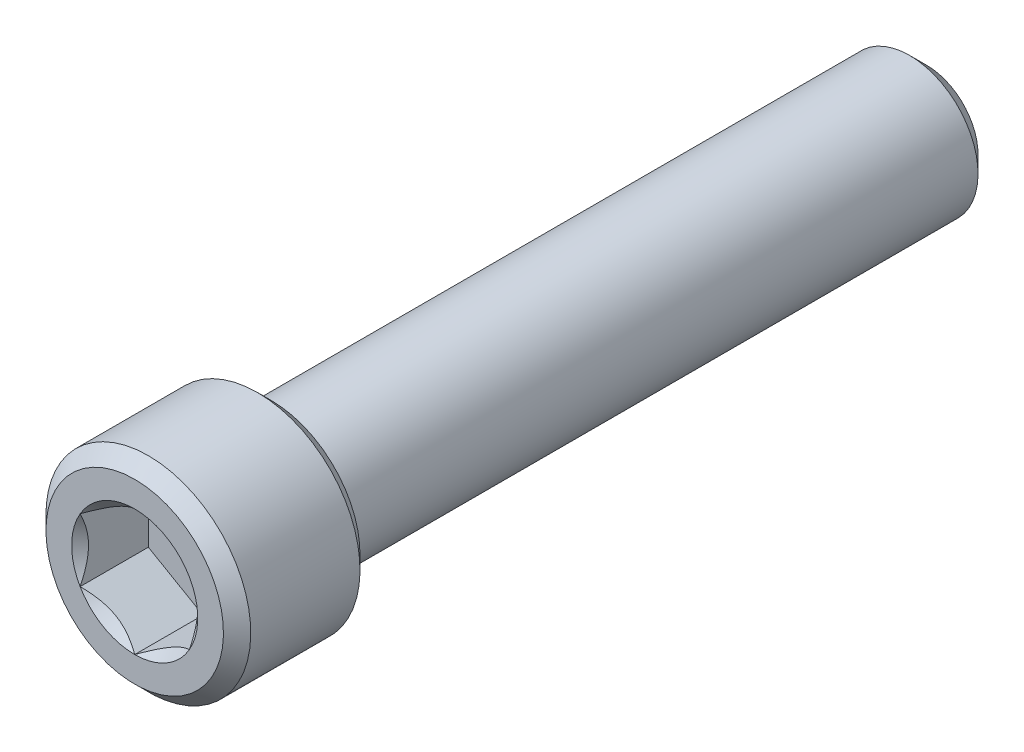
ISO-10303-21;
HEADER;
FILE_DESCRIPTION(('STEP AP214'),'2;1');
FILE_NAME('part.step','',(''),(''),'','','');
FILE_SCHEMA(('AUTOMOTIVE_DESIGN { 1 0 10303 214 1 1 1 1 }'));
ENDSEC;
DATA;
#1=APPLICATION_CONTEXT('core data for automotive mechanical design processes');
#2=APPLICATION_PROTOCOL_DEFINITION('international standard','automotive_design',2000,#1);
#3=PRODUCT_CONTEXT('',#1,'mechanical');
#4=PRODUCT('Part','Part','',(#3));
#5=PRODUCT_RELATED_PRODUCT_CATEGORY('part','',(#4));
#6=PRODUCT_DEFINITION_FORMATION('','',#4);
#7=PRODUCT_DEFINITION_CONTEXT('part definition',#1,'design');
#8=PRODUCT_DEFINITION('design','',#6,#7);
#9=PRODUCT_DEFINITION_SHAPE('','',#8);
#10=(LENGTH_UNIT() NAMED_UNIT(*) SI_UNIT(.MILLI.,.METRE.));
#11=(NAMED_UNIT(*) PLANE_ANGLE_UNIT() SI_UNIT($,.RADIAN.));
#12=(NAMED_UNIT(*) SI_UNIT($,.STERADIAN.) SOLID_ANGLE_UNIT());
#13=UNCERTAINTY_MEASURE_WITH_UNIT(LENGTH_MEASURE(1.E-05),#10,'distance_accuracy_value','');
#14=(GEOMETRIC_REPRESENTATION_CONTEXT(3) GLOBAL_UNCERTAINTY_ASSIGNED_CONTEXT((#13)) GLOBAL_UNIT_ASSIGNED_CONTEXT((#10,
#11,#12)) REPRESENTATION_CONTEXT('',''));
#15=CARTESIAN_POINT('',(0.,0.,0.));
#16=DIRECTION('',(0.,0.,1.));
#17=DIRECTION('',(1.,0.,0.));
#18=AXIS2_PLACEMENT_3D('',#15,#16,#17);
#19=CARTESIAN_POINT('',(0.,2.98732222221433,-23.01875));
#20=DIRECTION('',(0.,0.,-1.));
#21=DIRECTION('',(0.,1.,0.));
#22=AXIS2_PLACEMENT_3D('',#19,#20,#21);
#23=PLANE('',#22);
#24=CARTESIAN_POINT('',(0.,0.,-23.01875));
#25=DIRECTION('',(0.,0.,-1.));
#26=DIRECTION('',(0.,1.,0.));
#27=AXIS2_PLACEMENT_3D('',#24,#25,#26);
#28=CIRCLE('',#27,2.98732222221433);
#29=CARTESIAN_POINT('',(0.,2.98732222221433,-23.01875));
#30=VERTEX_POINT('',#29);
#31=EDGE_CURVE('E209',#30,#30,#28,.T.);
#32=ORIENTED_EDGE('',*,*,#31,.T.);
#33=EDGE_LOOP('',(#32));
#34=FACE_BOUND('',#33,.T.);
#35=ADVANCED_FACE('F39',(#34),#23,.T.);
#36=CARTESIAN_POINT('',(0.,0.,23.01875));
#37=DIRECTION('',(0.,0.,1.));
#38=DIRECTION('',(0.,-1.,0.));
#39=AXIS2_PLACEMENT_3D('',#36,#37,#38);
#40=PLANE('',#39);
#41=CARTESIAN_POINT('',(0.,0.,23.01875));
#42=DIRECTION('',(0.,0.,1.));
#43=DIRECTION('',(1.,0.,0.));
#44=AXIS2_PLACEMENT_3D('',#41,#42,#43);
#45=CIRCLE('',#44,3.66617420935413);
#46=CARTESIAN_POINT('',(0.,-3.66617420935413,23.01875));
#47=VERTEX_POINT('',#46);
#48=CARTESIAN_POINT('',(3.17500000000001,-1.83308710467706,23.01875));
#49=VERTEX_POINT('',#48);
#50=EDGE_CURVE('E108',#47,#49,#45,.T.);
#51=ORIENTED_EDGE('',*,*,#50,.F.);
#52=CARTESIAN_POINT('',(-3.175,-1.83308710467706,23.01875));
#53=VERTEX_POINT('',#52);
#54=EDGE_CURVE('E96',#53,#47,#45,.T.);
#55=ORIENTED_EDGE('',*,*,#54,.F.);
#56=CARTESIAN_POINT('',(-3.17500000000001,1.83308710467706,23.01875));
#57=VERTEX_POINT('',#56);
#58=EDGE_CURVE('E110',#57,#53,#45,.T.);
#59=ORIENTED_EDGE('',*,*,#58,.F.);
#60=CARTESIAN_POINT('',(0.,3.66617420935413,23.01875));
#61=VERTEX_POINT('',#60);
#62=EDGE_CURVE('E59',#61,#57,#45,.T.);
#63=ORIENTED_EDGE('',*,*,#62,.F.);
#64=CARTESIAN_POINT('',(3.175,1.83308710467707,23.01875));
#65=VERTEX_POINT('',#64);
#66=EDGE_CURVE('E62',#65,#61,#45,.T.);
#67=ORIENTED_EDGE('',*,*,#66,.F.);
#68=EDGE_CURVE('E139',#49,#65,#45,.T.);
#69=ORIENTED_EDGE('',*,*,#68,.F.);
#70=EDGE_LOOP('',(#51,#55,#59,#63,#67,#69));
#71=FACE_BOUND('',#70,.T.);
#72=CARTESIAN_POINT('',(0.,0.,23.01875));
#73=DIRECTION('',(0.,0.,-1.));
#74=DIRECTION('',(0.,1.,0.));
#75=AXIS2_PLACEMENT_3D('',#72,#73,#74);
#76=CIRCLE('',#75,5.159375);
#77=CARTESIAN_POINT('',(0.,5.159375,23.01875));
#78=VERTEX_POINT('',#77);
#79=EDGE_CURVE('E55',#78,#78,#76,.T.);
#80=ORIENTED_EDGE('',*,*,#79,.F.);
#81=EDGE_LOOP('',(#80));
#82=FACE_BOUND('',#81,.T.);
#83=ADVANCED_FACE('F134',(#71,#82),#40,.T.);
#84=CARTESIAN_POINT('',(0.,0.,22.225));
#85=DIRECTION('',(0.,0.,-1.));
#86=DIRECTION('',(0.,1.,0.));
#87=AXIS2_PLACEMENT_3D('',#84,#85,#86);
#88=CONICAL_SURFACE('',#87,5.953125,0.785398163397449);
#89=ORIENTED_EDGE('',*,*,#79,.T.);
#90=EDGE_LOOP('',(#89));
#91=FACE_BOUND('',#90,.T.);
#92=CARTESIAN_POINT('',(0.,0.,22.225));
#93=DIRECTION('',(0.,0.,-1.));
#94=DIRECTION('',(0.,1.,0.));
#95=AXIS2_PLACEMENT_3D('',#92,#93,#94);
#96=CIRCLE('',#95,5.953125);
#97=CARTESIAN_POINT('',(0.,5.95312499999999,22.225));
#98=VERTEX_POINT('',#97);
#99=EDGE_CURVE('E226',#98,#98,#96,.T.);
#100=ORIENTED_EDGE('',*,*,#99,.F.);
#101=EDGE_LOOP('',(#100));
#102=FACE_BOUND('',#101,.T.);
#103=ADVANCED_FACE('F207',(#91,#102),#88,.T.);
#104=CARTESIAN_POINT('',(0.,0.,-23.01875));
#105=DIRECTION('',(0.,0.,-1.));
#106=DIRECTION('',(0.,1.,0.));
#107=AXIS2_PLACEMENT_3D('',#104,#105,#106);
#108=CYLINDRICAL_SURFACE('',#107,5.953125);
#109=ORIENTED_EDGE('',*,*,#99,.T.);
#110=EDGE_LOOP('',(#109));
#111=FACE_BOUND('',#110,.T.);
#112=CARTESIAN_POINT('',(0.,0.,15.875));
#113=DIRECTION('',(0.,0.,-1.));
#114=DIRECTION('',(0.,1.,0.));
#115=AXIS2_PLACEMENT_3D('',#112,#113,#114);
#116=CIRCLE('',#115,5.953125);
#117=CARTESIAN_POINT('',(0.,5.95312499999999,15.875));
#118=VERTEX_POINT('',#117);
#119=EDGE_CURVE('E222',#118,#118,#116,.T.);
#120=ORIENTED_EDGE('',*,*,#119,.F.);
#121=EDGE_LOOP('',(#120));
#122=FACE_BOUND('',#121,.T.);
#123=ADVANCED_FACE('F234',(#111,#122),#108,.T.);
#124=CARTESIAN_POINT('',(0.,0.,15.08125));
#125=DIRECTION('',(0.,0.,1.));
#126=DIRECTION('',(0.,-1.,0.));
#127=AXIS2_PLACEMENT_3D('',#124,#125,#126);
#128=CONICAL_SURFACE('',#127,5.159375,0.785398163397453);
#129=ORIENTED_EDGE('',*,*,#119,.T.);
#130=EDGE_LOOP('',(#129));
#131=FACE_BOUND('',#130,.T.);
#132=CARTESIAN_POINT('',(0.,0.,15.08125));
#133=DIRECTION('',(0.,0.,-1.));
#134=DIRECTION('',(0.,1.,0.));
#135=AXIS2_PLACEMENT_3D('',#132,#133,#134);
#136=CIRCLE('',#135,5.159375);
#137=CARTESIAN_POINT('',(0.,5.15937499999999,15.08125));
#138=VERTEX_POINT('',#137);
#139=EDGE_CURVE('E221',#138,#138,#136,.T.);
#140=ORIENTED_EDGE('',*,*,#139,.F.);
#141=EDGE_LOOP('',(#140));
#142=FACE_BOUND('',#141,.T.);
#143=ADVANCED_FACE('F239',(#131,#142),#128,.T.);
#144=CARTESIAN_POINT('',(0.,5.15937499999999,15.08125));
#145=DIRECTION('',(0.,0.,-1.));
#146=DIRECTION('',(0.,1.,0.));
#147=AXIS2_PLACEMENT_3D('',#144,#145,#146);
#148=PLANE('',#147);
#149=ORIENTED_EDGE('',*,*,#139,.T.);
#150=EDGE_LOOP('',(#149));
#151=FACE_BOUND('',#150,.T.);
#152=CARTESIAN_POINT('',(0.,0.,15.08125));
#153=DIRECTION('',(0.,0.,-1.));
#154=DIRECTION('',(0.,1.,0.));
#155=AXIS2_PLACEMENT_3D('',#152,#153,#154);
#156=CIRCLE('',#155,3.9751);
#157=CARTESIAN_POINT('',(0.,3.9751,15.08125));
#158=VERTEX_POINT('',#157);
#159=EDGE_CURVE('E214',#158,#158,#156,.T.);
#160=ORIENTED_EDGE('',*,*,#159,.F.);
#161=EDGE_LOOP('',(#160));
#162=FACE_BOUND('',#161,.T.);
#163=ADVANCED_FACE('F246',(#151,#162),#148,.T.);
#164=CARTESIAN_POINT('',(0.,0.,-23.01875));
#165=DIRECTION('',(0.,0.,-1.));
#166=DIRECTION('',(0.,1.,0.));
#167=AXIS2_PLACEMENT_3D('',#164,#165,#166);
#168=CYLINDRICAL_SURFACE('',#167,3.97510000000001);
#169=ORIENTED_EDGE('',*,*,#159,.T.);
#170=EDGE_LOOP('',(#169));
#171=FACE_BOUND('',#170,.T.);
#172=CARTESIAN_POINT('',(0.,0.,-22.0309722222143));
#173=DIRECTION('',(0.,0.,-1.));
#174=DIRECTION('',(0.,1.,0.));
#175=AXIS2_PLACEMENT_3D('',#172,#173,#174);
#176=CIRCLE('',#175,3.97510000000001);
#177=CARTESIAN_POINT('',(0.,3.97510000000001,-22.0309722222143));
#178=VERTEX_POINT('',#177);
#179=EDGE_CURVE('E213',#178,#178,#176,.T.);
#180=ORIENTED_EDGE('',*,*,#179,.F.);
#181=EDGE_LOOP('',(#180));
#182=FACE_BOUND('',#181,.T.);
#183=ADVANCED_FACE('F255',(#171,#182),#168,.T.);
#184=CARTESIAN_POINT('',(0.,0.,-23.01875));
#185=DIRECTION('',(0.,0.,1.));
#186=DIRECTION('',(0.,-1.,0.));
#187=AXIS2_PLACEMENT_3D('',#184,#185,#186);
#188=CONICAL_SURFACE('',#187,2.98732222221433,0.785398163397451);
#189=ORIENTED_EDGE('',*,*,#179,.T.);
#190=EDGE_LOOP('',(#189));
#191=FACE_BOUND('',#190,.T.);
#192=ORIENTED_EDGE('',*,*,#31,.F.);
#193=EDGE_LOOP('',(#192));
#194=FACE_BOUND('',#193,.T.);
#195=ADVANCED_FACE('F256',(#191,#194),#188,.T.);
#196=CARTESIAN_POINT('',(0.,0.,23.01875));
#197=DIRECTION('',(0.,0.,1.));
#198=DIRECTION('',(1.,0.,0.));
#199=AXIS2_PLACEMENT_3D('',#196,#197,#198);
#200=CONICAL_SURFACE('',#199,3.66617420935413,0.78539816339745);
#201=ORIENTED_EDGE('',*,*,#50,.T.);
#202=CARTESIAN_POINT('',(-0.000199999999999354,-3.66628967940796,23.0188654755089));
#203=CARTESIAN_POINT('',(0.108938349949827,-3.60327862368552,22.9559089836918));
#204=CARTESIAN_POINT('',(0.219901628077946,-3.53921394518809,22.8966501042347));
#205=CARTESIAN_POINT('',(0.446167846345947,-3.40857908316254,22.7881486557306));
#206=CARTESIAN_POINT('',(0.561492303252262,-3.34199647692353,22.7389664539387));
#207=CARTESIAN_POINT('',(0.794038522480625,-3.207735854653,22.654716458874));
#208=CARTESIAN_POINT('',(0.911201066281149,-3.14009202845083,22.6194369144994));
#209=CARTESIAN_POINT('',(1.14810544464628,-3.00331522182952,22.5650815701348));
#210=CARTESIAN_POINT('',(1.26784004264355,-2.93418641944448,22.5459651975296));
#211=CARTESIAN_POINT('',(1.47419791875158,-2.81504564412412,22.5287171306232));
#212=CARTESIAN_POINT('',(1.56055470772915,-2.76518752876156,22.5261639336138));
#213=CARTESIAN_POINT('',(1.73312781652471,-2.66555239794355,22.5304662731233));
#214=CARTESIAN_POINT('',(1.8193440764928,-2.61577541704245,22.5373251080214));
#215=CARTESIAN_POINT('',(1.99095979158713,-2.51669303773558,22.5600598833037));
#216=CARTESIAN_POINT('',(2.07635822425327,-2.46738822964741,22.5759459096873));
#217=CARTESIAN_POINT('',(2.24568840330547,-2.36962540518969,22.615867983998));
#218=CARTESIAN_POINT('',(2.32962026161974,-2.32116732419836,22.6399034070852));
#219=CARTESIAN_POINT('',(2.47862357928411,-2.23514021863469,22.6893552344172));
#220=CARTESIAN_POINT('',(2.54402485119173,-2.19738077669348,22.713471719301));
#221=CARTESIAN_POINT('',(2.6736532502051,-2.12253978562849,22.7655914671372));
#222=CARTESIAN_POINT('',(2.73788034144172,-2.08545825721376,22.7935948486035));
#223=CARTESIAN_POINT('',(2.8649580345126,-2.01208991691129,22.8528605655445));
#224=CARTESIAN_POINT('',(2.92781225074872,-1.97580101824767,22.8841126533542));
#225=CARTESIAN_POINT('',(3.05235662084809,-1.90389529264474,22.9494653443919));
#226=CARTESIAN_POINT('',(3.11404746097871,-1.8682780694888,22.9835641995185));
#227=CARTESIAN_POINT('',(3.1752,-1.83297163462323,23.0188654755089));
#228=B_SPLINE_CURVE_WITH_KNOTS('',3,(#202,#203,#204,#205,#206,#207,#208,#209,#210,#211,#212,
#213,#214,#215,#216,#217,#218,#219,#220,#221,#222,#223,#224,#225,#226,#227),.UNSPECIFIED.,.F.,
.F.,(4,2,2,2,2,2,2,2,2,2,2,2,4),(0.,0.422910572436808,0.848285055427806,1.26690402276127,
1.68446903107506,1.98329272958351,2.2822211754689,2.58148426995465,2.88072442418451,
3.11844134429546,3.35616551414405,3.59316134346766,3.83001269744429),.UNSPECIFIED.);
#229=EDGE_CURVE('E11',#47,#49,#228,.T.);
#230=ORIENTED_EDGE('',*,*,#229,.F.);
#231=EDGE_LOOP('',(#201,#230));
#232=FACE_BOUND('',#231,.T.);
#233=ADVANCED_FACE('F115',(#232),#200,.F.);
#234=ORIENTED_EDGE('',*,*,#68,.T.);
#235=CARTESIAN_POINT('',(3.175,-3.65592387452516,24.1947245261065));
#236=CARTESIAN_POINT('',(3.175,-3.56690614739902,24.127529557288));
#237=CARTESIAN_POINT('',(3.175,-3.47739001482927,24.0609841167795));
#238=CARTESIAN_POINT('',(3.175,-3.29716433407819,23.929483107989));
#239=CARTESIAN_POINT('',(3.175,-3.20645449195236,23.8645279430093));
#240=CARTESIAN_POINT('',(3.175,-3.02298124672425,23.7360364725883));
#241=CARTESIAN_POINT('',(3.175,-2.93020737789476,23.6725150605195));
#242=CARTESIAN_POINT('',(3.175,-2.74308490461526,23.5478432312395));
#243=CARTESIAN_POINT('',(3.175,-2.64873641209623,23.486692646518));
#244=CARTESIAN_POINT('',(3.175,-2.45276910629101,23.3638772914686));
#245=CARTESIAN_POINT('',(3.175,-2.35104296923552,23.3023829000351));
#246=CARTESIAN_POINT('',(3.175,-2.14521620329061,23.1834400241102));
#247=CARTESIAN_POINT('',(3.175,-2.04111520164361,23.1259921806284));
#248=CARTESIAN_POINT('',(3.175,-1.8305483898592,23.0163819262114));
#249=CARTESIAN_POINT('',(3.175,-1.72409073387149,22.9642039734131));
#250=CARTESIAN_POINT('',(3.175,-1.50827203793058,22.8663015698251));
#251=CARTESIAN_POINT('',(3.175,-1.39891233941784,22.8205741969929));
#252=CARTESIAN_POINT('',(3.175,-1.18604701054559,22.7405561753707));
#253=CARTESIAN_POINT('',(3.175,-1.08277848917347,22.7056413049656));
#254=CARTESIAN_POINT('',(3.175,-0.873755153890325,22.6440963349262));
#255=CARTESIAN_POINT('',(3.175,-0.768000169236099,22.6174668060366));
#256=CARTESIAN_POINT('',(3.175,-0.556394353071966,22.5743261950481));
#257=CARTESIAN_POINT('',(3.175,-0.450579451492894,22.5576417495798));
#258=CARTESIAN_POINT('',(3.175,-0.237818454981047,22.534715141782));
#259=CARTESIAN_POINT('',(3.175,-0.13087255768011,22.5284711844441));
#260=CARTESIAN_POINT('',(3.175,0.0792250150830025,22.5268892728023));
#261=CARTESIAN_POINT('',(3.175,0.182373911993818,22.531164748002));
#262=CARTESIAN_POINT('',(3.175,0.387788153537297,22.5495326749881));
#263=CARTESIAN_POINT('',(3.175,0.490053411359904,22.5636260804471));
#264=CARTESIAN_POINT('',(3.175,0.694689208906973,22.6011006951935));
#265=CARTESIAN_POINT('',(3.175,0.797030337701613,22.6246399593543));
#266=CARTESIAN_POINT('',(3.175,0.999482692253837,22.6797509009592));
#267=CARTESIAN_POINT('',(3.175,1.09959410383402,22.7113219063006));
#268=CARTESIAN_POINT('',(3.175,1.30666025401972,22.7844470266187));
#269=CARTESIAN_POINT('',(3.175,1.4133805811312,22.8266582387017));
#270=CARTESIAN_POINT('',(3.175,1.6240351260801,22.9175553663247));
#271=CARTESIAN_POINT('',(3.175,1.72796839622315,22.9662434515018));
#272=CARTESIAN_POINT('',(3.175,1.93357808805447,23.0689437756761));
#273=CARTESIAN_POINT('',(3.175,2.03524592560239,23.1229730621693));
#274=CARTESIAN_POINT('',(3.175,2.23624195707291,23.2351589013647));
#275=CARTESIAN_POINT('',(3.175,2.3355705197654,23.2933147976569));
#276=CARTESIAN_POINT('',(3.175,2.52730642275902,23.4099651155039));
#277=CARTESIAN_POINT('',(3.175,2.61981218330511,23.4682986191933));
#278=CARTESIAN_POINT('',(3.175,2.80323560367684,23.5874186494698));
#279=CARTESIAN_POINT('',(3.175,2.89415314246283,23.6482053618594));
#280=CARTESIAN_POINT('',(3.175,3.07387072487128,23.7712912164829));
#281=CARTESIAN_POINT('',(3.175,3.16268196996071,23.8335740620494));
#282=CARTESIAN_POINT('',(3.175,3.33909075370388,23.9597868324862));
#283=CARTESIAN_POINT('',(3.175,3.42668861940901,24.0237162997018));
#284=CARTESIAN_POINT('',(3.175,3.51377838474595,24.0883189780567));
#285=B_SPLINE_CURVE_WITH_KNOTS('',3,(#235,#236,#237,#238,#239,#240,#241,#242,#243,#244,#245,
#246,#247,#248,#249,#250,#251,#252,#253,#254,#255,#256,#257,#258,#259,#260,#261,#262,#263,#264,
#265,#266,#267,#268,#269,#270,#271,#272,#273,#274,#275,#276,#277,#278,#279,#280,#281,#282,#283,
#284),.UNSPECIFIED.,.F.,.F.,(4,2,2,2,2,2,2,2,2,2,2,2,2,2,2,2,2,2,2,2,2,2,2,2,4),(0.,
0.334601712013317,0.669287419770513,1.00656636796479,1.3438214421939,1.70035269072414,
2.05694029057745,2.41244349871029,2.76778514705124,3.09453137075716,3.42130009774479,
3.74219200698696,4.06302874036784,4.37225254917033,4.68150639886781,4.99616636831742,
5.31080001541914,5.65482708645254,5.99896969199844,6.34424851858142,6.68947254507109,
7.01751396994993,7.34558028700741,7.67098168170701,7.99629359145139),.UNSPECIFIED.);
#286=EDGE_CURVE('E140',#49,#65,#285,.T.);
#287=ORIENTED_EDGE('',*,*,#286,.F.);
#288=EDGE_LOOP('',(#234,#287));
#289=FACE_BOUND('',#288,.T.);
#290=ADVANCED_FACE('F270',(#289),#200,.F.);
#291=ORIENTED_EDGE('',*,*,#66,.T.);
#292=CARTESIAN_POINT('',(3.1752,1.83297163462322,23.0188654755089));
#293=CARTESIAN_POINT('',(3.06606165005017,1.89598269034567,22.9559089836918));
#294=CARTESIAN_POINT('',(2.95509837192205,1.9600473688431,22.8966501042347));
#295=CARTESIAN_POINT('',(2.72883215365405,2.09068223086865,22.7881486557306));
#296=CARTESIAN_POINT('',(2.61350769674774,2.15726483710766,22.7389664539387));
#297=CARTESIAN_POINT('',(2.38096147751937,2.29152545937818,22.654716458874));
#298=CARTESIAN_POINT('',(2.26379893371885,2.35916928558036,22.6194369144995));
#299=CARTESIAN_POINT('',(2.02689455535372,2.49594609220167,22.5650815701348));
#300=CARTESIAN_POINT('',(1.90715995735645,2.5650748945867,22.5459651975296));
#301=CARTESIAN_POINT('',(1.70080208124842,2.68421566990707,22.5287171306232));
#302=CARTESIAN_POINT('',(1.61444529227085,2.73407378526962,22.5261639336138));
#303=CARTESIAN_POINT('',(1.44187218347529,2.83370891608763,22.5304662731233));
#304=CARTESIAN_POINT('',(1.3556559235072,2.88348589698873,22.5373251080214));
#305=CARTESIAN_POINT('',(1.18404020841287,2.98256827629561,22.5600598833037));
#306=CARTESIAN_POINT('',(1.09864177574673,3.03187308438378,22.5759459096873));
#307=CARTESIAN_POINT('',(0.929311596694528,3.1296359088415,22.615867983998));
#308=CARTESIAN_POINT('',(0.845379738380254,3.17809398983283,22.6399034070852));
#309=CARTESIAN_POINT('',(0.696376420715886,3.2641210953965,22.6893552344172));
#310=CARTESIAN_POINT('',(0.630975148808269,3.3018805373377,22.713471719301));
#311=CARTESIAN_POINT('',(0.501346749794894,3.3767215284027,22.7655914671372));
#312=CARTESIAN_POINT('',(0.437119658558277,3.41380305681742,22.7935948486035));
#313=CARTESIAN_POINT('',(0.3100419654874,3.48717139711989,22.8528605655445));
#314=CARTESIAN_POINT('',(0.247187749251276,3.52346029578352,22.8841126533542));
#315=CARTESIAN_POINT('',(0.122643379151906,3.59536602138644,22.9494653443919));
#316=CARTESIAN_POINT('',(0.0609525390212892,3.63098324454239,22.9835641995185));
#317=CARTESIAN_POINT('',(-0.000200000000001283,3.66628967940796,23.0188654755089));
#318=B_SPLINE_CURVE_WITH_KNOTS('',3,(#292,#293,#294,#295,#296,#297,#298,#299,#300,#301,#302,
#303,#304,#305,#306,#307,#308,#309,#310,#311,#312,#313,#314,#315,#316,#317),.UNSPECIFIED.,.F.,
.F.,(4,2,2,2,2,2,2,2,2,2,2,2,4),(0.,0.422910572436807,0.848285055427807,1.26690402276127,
1.68446903107506,1.98329272958351,2.2822211754689,2.58148426995465,2.88072442418451,
3.11844134429546,3.35616551414405,3.59316134346766,3.8300126974443),.UNSPECIFIED.);
#319=EDGE_CURVE('E148',#65,#61,#318,.T.);
#320=ORIENTED_EDGE('',*,*,#319,.F.);
#321=EDGE_LOOP('',(#291,#320));
#322=FACE_BOUND('',#321,.T.);
#323=ADVANCED_FACE('F307',(#322),#200,.F.);
#324=ORIENTED_EDGE('',*,*,#62,.T.);
#325=CARTESIAN_POINT('',(0.00019999999999895,3.66628967940796,23.0188654755089));
#326=CARTESIAN_POINT('',(-0.108938349949827,3.60327862368552,22.9559089836918));
#327=CARTESIAN_POINT('',(-0.219901628077946,3.53921394518808,22.8966501042347));
#328=CARTESIAN_POINT('',(-0.446167846345948,3.40857908316253,22.7881486557306));
#329=CARTESIAN_POINT('',(-0.561492303252264,3.34199647692353,22.7389664539387));
#330=CARTESIAN_POINT('',(-0.794038522480627,3.207735854653,22.654716458874));
#331=CARTESIAN_POINT('',(-0.911201066281151,3.14009202845083,22.6194369144995));
#332=CARTESIAN_POINT('',(-1.14810544464628,3.00331522182952,22.5650815701348));
#333=CARTESIAN_POINT('',(-1.26784004264355,2.93418641944448,22.5459651975296));
#334=CARTESIAN_POINT('',(-1.47419791875158,2.81504564412411,22.5287171306232));
#335=CARTESIAN_POINT('',(-1.56055470772915,2.76518752876156,22.5261639336138));
#336=CARTESIAN_POINT('',(-1.73312781652471,2.66555239794355,22.5304662731233));
#337=CARTESIAN_POINT('',(-1.8193440764928,2.61577541704245,22.5373251080214));
#338=CARTESIAN_POINT('',(-1.99095979158713,2.51669303773557,22.5600598833037));
#339=CARTESIAN_POINT('',(-2.07635822425327,2.4673882296474,22.5759459096873));
#340=CARTESIAN_POINT('',(-2.24568840330547,2.36962540518969,22.615867983998));
#341=CARTESIAN_POINT('',(-2.32962026161975,2.32116732419836,22.6399034070852));
#342=CARTESIAN_POINT('',(-2.47862357928411,2.23514021863468,22.6893552344172));
#343=CARTESIAN_POINT('',(-2.54402485119173,2.19738077669348,22.713471719301));
#344=CARTESIAN_POINT('',(-2.67365325020511,2.12253978562849,22.7655914671372));
#345=CARTESIAN_POINT('',(-2.73788034144172,2.08545825721376,22.7935948486035));
#346=CARTESIAN_POINT('',(-2.8649580345126,2.01208991691129,22.8528605655445));
#347=CARTESIAN_POINT('',(-2.92781225074872,1.97580101824766,22.8841126533542));
#348=CARTESIAN_POINT('',(-3.05235662084809,1.90389529264474,22.9494653443919));
#349=CARTESIAN_POINT('',(-3.11404746097871,1.86827806948879,22.9835641995185));
#350=CARTESIAN_POINT('',(-3.1752,1.83297163462322,23.0188654755089));
#351=B_SPLINE_CURVE_WITH_KNOTS('',3,(#325,#326,#327,#328,#329,#330,#331,#332,#333,#334,#335,
#336,#337,#338,#339,#340,#341,#342,#343,#344,#345,#346,#347,#348,#349,#350),.UNSPECIFIED.,.F.,
.F.,(4,2,2,2,2,2,2,2,2,2,2,2,4),(0.,0.422910572436808,0.848285055427808,1.26690402276127,
1.68446903107506,1.98329272958351,2.2822211754689,2.58148426995465,2.88072442418451,
3.11844134429546,3.35616551414405,3.59316134346766,3.8300126974443),.UNSPECIFIED.);
#352=EDGE_CURVE('E168',#61,#57,#351,.T.);
#353=ORIENTED_EDGE('',*,*,#352,.F.);
#354=EDGE_LOOP('',(#324,#353));
#355=FACE_BOUND('',#354,.T.);
#356=ADVANCED_FACE('F304',(#355),#200,.F.);
#357=ORIENTED_EDGE('',*,*,#58,.T.);
#358=CARTESIAN_POINT('',(-3.175,-3.65592387452516,24.1947245261065));
#359=CARTESIAN_POINT('',(-3.175,-3.56690614739902,24.127529557288));
#360=CARTESIAN_POINT('',(-3.175,-3.47739001482928,24.0609841167795));
#361=CARTESIAN_POINT('',(-3.175,-3.29716433407819,23.929483107989));
#362=CARTESIAN_POINT('',(-3.175,-3.20645449195236,23.8645279430093));
#363=CARTESIAN_POINT('',(-3.175,-3.02298124672425,23.7360364725883));
#364=CARTESIAN_POINT('',(-3.175,-2.93020737789477,23.6725150605195));
#365=CARTESIAN_POINT('',(-3.175,-2.74308490461527,23.5478432312395));
#366=CARTESIAN_POINT('',(-3.175,-2.64873641209624,23.486692646518));
#367=CARTESIAN_POINT('',(-3.175,-2.45276910629102,23.3638772914686));
#368=CARTESIAN_POINT('',(-3.175,-2.35104296923552,23.3023829000351));
#369=CARTESIAN_POINT('',(-3.175,-2.14521620329061,23.1834400241102));
#370=CARTESIAN_POINT('',(-3.175,-2.04111520164361,23.1259921806284));
#371=CARTESIAN_POINT('',(-3.175,-1.8305483898592,23.0163819262114));
#372=CARTESIAN_POINT('',(-3.175,-1.72409073387149,22.9642039734131));
#373=CARTESIAN_POINT('',(-3.175,-1.50827203793059,22.8663015698251));
#374=CARTESIAN_POINT('',(-3.175,-1.39891233941785,22.8205741969929));
#375=CARTESIAN_POINT('',(-3.175,-1.1860470105456,22.7405561753708));
#376=CARTESIAN_POINT('',(-3.175,-1.08277848917348,22.7056413049656));
#377=CARTESIAN_POINT('',(-3.175,-0.873755153890329,22.6440963349262));
#378=CARTESIAN_POINT('',(-3.175,-0.768000169236102,22.6174668060366));
#379=CARTESIAN_POINT('',(-3.175,-0.556394353071968,22.5743261950481));
#380=CARTESIAN_POINT('',(-3.175,-0.450579451492896,22.5576417495798));
#381=CARTESIAN_POINT('',(-3.175,-0.237818454981048,22.534715141782));
#382=CARTESIAN_POINT('',(-3.175,-0.130872557680111,22.5284711844441));
#383=CARTESIAN_POINT('',(-3.175,0.0792250150830016,22.5268892728023));
#384=CARTESIAN_POINT('',(-3.175,0.182373911993817,22.531164748002));
#385=CARTESIAN_POINT('',(-3.175,0.387788153537296,22.5495326749881));
#386=CARTESIAN_POINT('',(-3.175,0.490053411359903,22.5636260804471));
#387=CARTESIAN_POINT('',(-3.175,0.694689208906972,22.6011006951935));
#388=CARTESIAN_POINT('',(-3.175,0.797030337701613,22.6246399593543));
#389=CARTESIAN_POINT('',(-3.175,0.999482692253837,22.6797509009592));
#390=CARTESIAN_POINT('',(-3.175,1.09959410383402,22.7113219063006));
#391=CARTESIAN_POINT('',(-3.175,1.30666025401972,22.7844470266187));
#392=CARTESIAN_POINT('',(-3.175,1.4133805811312,22.8266582387017));
#393=CARTESIAN_POINT('',(-3.175,1.6240351260801,22.9175553663247));
#394=CARTESIAN_POINT('',(-3.175,1.72796839622315,22.9662434515018));
#395=CARTESIAN_POINT('',(-3.175,1.93357808805447,23.0689437756761));
#396=CARTESIAN_POINT('',(-3.175,2.03524592560239,23.1229730621693));
#397=CARTESIAN_POINT('',(-3.175,2.23624195707291,23.2351589013648));
#398=CARTESIAN_POINT('',(-3.175,2.3355705197654,23.2933147976569));
#399=CARTESIAN_POINT('',(-3.175,2.52730642275902,23.4099651155039));
#400=CARTESIAN_POINT('',(-3.175,2.61981218330511,23.4682986191933));
#401=CARTESIAN_POINT('',(-3.175,2.80323560367684,23.5874186494698));
#402=CARTESIAN_POINT('',(-3.175,2.89415314246283,23.6482053618594));
#403=CARTESIAN_POINT('',(-3.175,3.07387072487128,23.7712912164829));
#404=CARTESIAN_POINT('',(-3.175,3.16268196996071,23.8335740620494));
#405=CARTESIAN_POINT('',(-3.175,3.33909075370388,23.9597868324862));
#406=CARTESIAN_POINT('',(-3.175,3.42668861940901,24.0237162997018));
#407=CARTESIAN_POINT('',(-3.175,3.51377838474595,24.0883189780567));
#408=B_SPLINE_CURVE_WITH_KNOTS('',3,(#358,#359,#360,#361,#362,#363,#364,#365,#366,#367,#368,
#369,#370,#371,#372,#373,#374,#375,#376,#377,#378,#379,#380,#381,#382,#383,#384,#385,#386,#387,
#388,#389,#390,#391,#392,#393,#394,#395,#396,#397,#398,#399,#400,#401,#402,#403,#404,#405,#406,
#407),.UNSPECIFIED.,.F.,.F.,(4,2,2,2,2,2,2,2,2,2,2,2,2,2,2,2,2,2,2,2,2,2,2,2,4),(0.,
0.334601712013316,0.669287419770512,1.00656636796479,1.3438214421939,1.70035269072413,
2.05694029057745,2.41244349871029,2.76778514705124,3.09453137075716,3.42130009774479,
3.74219200698696,4.06302874036785,4.37225254917033,4.68150639886781,4.99616636831742,
5.31080001541914,5.65482708645254,5.99896969199844,6.34424851858142,6.68947254507109,
7.01751396994994,7.34558028700741,7.67098168170701,7.99629359145139),.UNSPECIFIED.);
#409=EDGE_CURVE('E121',#57,#53,#408,.F.);
#410=ORIENTED_EDGE('',*,*,#409,.F.);
#411=EDGE_LOOP('',(#357,#410));
#412=FACE_BOUND('',#411,.T.);
#413=ADVANCED_FACE('F158',(#412),#200,.F.);
#414=ORIENTED_EDGE('',*,*,#54,.T.);
#415=CARTESIAN_POINT('',(-3.1752,-1.83297163462323,23.0188654755089));
#416=CARTESIAN_POINT('',(-3.06606165005017,-1.89598269034567,22.9559089836918));
#417=CARTESIAN_POINT('',(-2.95509837192205,-1.9600473688431,22.8966501042347));
#418=CARTESIAN_POINT('',(-2.72883215365405,-2.09068223086865,22.7881486557306));
#419=CARTESIAN_POINT('',(-2.61350769674774,-2.15726483710766,22.7389664539387));
#420=CARTESIAN_POINT('',(-2.38096147751937,-2.29152545937819,22.654716458874));
#421=CARTESIAN_POINT('',(-2.26379893371885,-2.35916928558036,22.6194369144994));
#422=CARTESIAN_POINT('',(-2.02689455535372,-2.49594609220167,22.5650815701348));
#423=CARTESIAN_POINT('',(-1.90715995735645,-2.56507489458671,22.5459651975296));
#424=CARTESIAN_POINT('',(-1.70080208124842,-2.68421566990707,22.5287171306232));
#425=CARTESIAN_POINT('',(-1.61444529227084,-2.73407378526963,22.5261639336138));
#426=CARTESIAN_POINT('',(-1.44187218347528,-2.83370891608764,22.5304662731233));
#427=CARTESIAN_POINT('',(-1.35565592350719,-2.88348589698873,22.5373251080214));
#428=CARTESIAN_POINT('',(-1.18404020841287,-2.98256827629561,22.5600598833037));
#429=CARTESIAN_POINT('',(-1.09864177574673,-3.03187308438378,22.5759459096873));
#430=CARTESIAN_POINT('',(-0.929311596694525,-3.1296359088415,22.615867983998));
#431=CARTESIAN_POINT('',(-0.845379738380251,-3.17809398983283,22.6399034070852));
#432=CARTESIAN_POINT('',(-0.696376420715883,-3.2641210953965,22.6893552344172));
#433=CARTESIAN_POINT('',(-0.630975148808267,-3.30188053733771,22.713471719301));
#434=CARTESIAN_POINT('',(-0.501346749794892,-3.3767215284027,22.7655914671372));
#435=CARTESIAN_POINT('',(-0.437119658558275,-3.41380305681743,22.7935948486035));
#436=CARTESIAN_POINT('',(-0.310041965487398,-3.48717139711989,22.8528605655445));
#437=CARTESIAN_POINT('',(-0.247187749251274,-3.52346029578352,22.8841126533542));
#438=CARTESIAN_POINT('',(-0.122643379151905,-3.59536602138645,22.9494653443919));
#439=CARTESIAN_POINT('',(-0.0609525390212888,-3.63098324454239,22.9835641995185));
#440=CARTESIAN_POINT('',(0.000200000000001496,-3.66628967940796,23.0188654755089));
#441=B_SPLINE_CURVE_WITH_KNOTS('',3,(#415,#416,#417,#418,#419,#420,#421,#422,#423,#424,#425,
#426,#427,#428,#429,#430,#431,#432,#433,#434,#435,#436,#437,#438,#439,#440),.UNSPECIFIED.,.F.,
.F.,(4,2,2,2,2,2,2,2,2,2,2,2,4),(0.,0.422910572436811,0.84828505542781,1.26690402276127,
1.68446903107506,1.98329272958352,2.2822211754689,2.58148426995466,2.88072442418452,
3.11844134429546,3.35616551414405,3.59316134346767,3.8300126974443),.UNSPECIFIED.);
#442=EDGE_CURVE('E105',#53,#47,#441,.T.);
#443=ORIENTED_EDGE('',*,*,#442,.F.);
#444=EDGE_LOOP('',(#414,#443));
#445=FACE_BOUND('',#444,.T.);
#446=ADVANCED_FACE('F99',(#445),#200,.F.);
#447=CARTESIAN_POINT('',(0.,0.,19.05));
#448=DIRECTION('',(0.,0.,1.));
#449=DIRECTION('',(1.,0.,0.));
#450=AXIS2_PLACEMENT_3D('',#447,#448,#449);
#451=PLANE('',#450);
#452=DIRECTION('',(0.866025403784439,-0.5,0.));
#453=VECTOR('',#452,1.);
#454=CARTESIAN_POINT('',(-3.175,-1.83308710467706,19.05));
#455=LINE('',#454,#453);
#456=CARTESIAN_POINT('',(-3.175,-1.83308710467706,19.05));
#457=VERTEX_POINT('',#456);
#458=CARTESIAN_POINT('',(0.,-3.66617420935412,19.05));
#459=VERTEX_POINT('',#458);
#460=EDGE_CURVE('E124',#457,#459,#455,.T.);
#461=ORIENTED_EDGE('',*,*,#460,.T.);
#462=DIRECTION('',(0.866025403784439,0.5,0.));
#463=VECTOR('',#462,1.);
#464=CARTESIAN_POINT('',(0.,-3.66617420935412,19.05));
#465=LINE('',#464,#463);
#466=CARTESIAN_POINT('',(3.175,-1.83308710467706,19.05));
#467=VERTEX_POINT('',#466);
#468=EDGE_CURVE('E126',#459,#467,#465,.T.);
#469=ORIENTED_EDGE('',*,*,#468,.T.);
#470=DIRECTION('',(0.,1.,0.));
#471=VECTOR('',#470,1.);
#472=CARTESIAN_POINT('',(3.175,-1.83308710467706,19.05));
#473=LINE('',#472,#471);
#474=CARTESIAN_POINT('',(3.175,1.83308710467706,19.05));
#475=VERTEX_POINT('',#474);
#476=EDGE_CURVE('E285',#467,#475,#473,.T.);
#477=ORIENTED_EDGE('',*,*,#476,.T.);
#478=DIRECTION('',(-0.866025403784439,0.5,0.));
#479=VECTOR('',#478,1.);
#480=CARTESIAN_POINT('',(3.175,1.83308710467706,19.05));
#481=LINE('',#480,#479);
#482=CARTESIAN_POINT('',(0.,3.66617420935412,19.05));
#483=VERTEX_POINT('',#482);
#484=EDGE_CURVE('E289',#475,#483,#481,.T.);
#485=ORIENTED_EDGE('',*,*,#484,.T.);
#486=DIRECTION('',(-0.866025403784438,-0.5,0.));
#487=VECTOR('',#486,1.);
#488=CARTESIAN_POINT('',(0.,3.66617420935412,19.05));
#489=LINE('',#488,#487);
#490=CARTESIAN_POINT('',(-3.175,1.83308710467706,19.05));
#491=VERTEX_POINT('',#490);
#492=EDGE_CURVE('E288',#483,#491,#489,.T.);
#493=ORIENTED_EDGE('',*,*,#492,.T.);
#494=DIRECTION('',(0.,-1.,0.));
#495=VECTOR('',#494,1.);
#496=CARTESIAN_POINT('',(-3.175,1.83308710467706,19.05));
#497=LINE('',#496,#495);
#498=EDGE_CURVE('E133',#491,#457,#497,.T.);
#499=ORIENTED_EDGE('',*,*,#498,.T.);
#500=EDGE_LOOP('',(#461,#469,#477,#485,#493,#499));
#501=FACE_BOUND('',#500,.T.);
#502=ADVANCED_FACE('F160',(#501),#451,.T.);
#503=CARTESIAN_POINT('',(0.,-3.66617420935412,19.05));
#504=DIRECTION('',(0.5,-0.866025403784439,0.));
#505=DIRECTION('',(0.866025403784439,0.5,0.));
#506=AXIS2_PLACEMENT_3D('',#503,#504,#505);
#507=PLANE('',#506);
#508=DIRECTION('',(0.,0.,1.));
#509=VECTOR('',#508,1.);
#510=CARTESIAN_POINT('',(0.,-3.66617420935412,19.05));
#511=LINE('',#510,#509);
#512=EDGE_CURVE('E118',#459,#47,#511,.T.);
#513=ORIENTED_EDGE('',*,*,#512,.T.);
#514=ORIENTED_EDGE('',*,*,#229,.T.);
#515=DIRECTION('',(0.,0.,1.));
#516=VECTOR('',#515,1.);
#517=CARTESIAN_POINT('',(3.175,-1.83308710467706,19.05));
#518=LINE('',#517,#516);
#519=EDGE_CURVE('E127',#467,#49,#518,.T.);
#520=ORIENTED_EDGE('',*,*,#519,.F.);
#521=ORIENTED_EDGE('',*,*,#468,.F.);
#522=EDGE_LOOP('',(#513,#514,#520,#521));
#523=FACE_BOUND('',#522,.T.);
#524=ADVANCED_FACE('F128',(#523),#507,.F.);
#525=CARTESIAN_POINT('',(3.175,-1.83308710467706,19.05));
#526=DIRECTION('',(1.,0.,0.));
#527=DIRECTION('',(0.,0.,-1.));
#528=AXIS2_PLACEMENT_3D('',#525,#526,#527);
#529=PLANE('',#528);
#530=ORIENTED_EDGE('',*,*,#519,.T.);
#531=ORIENTED_EDGE('',*,*,#286,.T.);
#532=DIRECTION('',(0.,0.,1.));
#533=VECTOR('',#532,1.);
#534=CARTESIAN_POINT('',(3.175,1.83308710467706,19.05));
#535=LINE('',#534,#533);
#536=EDGE_CURVE('E300',#475,#65,#535,.T.);
#537=ORIENTED_EDGE('',*,*,#536,.F.);
#538=ORIENTED_EDGE('',*,*,#476,.F.);
#539=EDGE_LOOP('',(#530,#531,#537,#538));
#540=FACE_BOUND('',#539,.T.);
#541=ADVANCED_FACE('F151',(#540),#529,.F.);
#542=CARTESIAN_POINT('',(3.175,1.83308710467706,19.05));
#543=DIRECTION('',(0.5,0.866025403784439,0.));
#544=DIRECTION('',(-0.866025403784439,0.5,0.));
#545=AXIS2_PLACEMENT_3D('',#542,#543,#544);
#546=PLANE('',#545);
#547=ORIENTED_EDGE('',*,*,#536,.T.);
#548=ORIENTED_EDGE('',*,*,#319,.T.);
#549=DIRECTION('',(0.,0.,1.));
#550=VECTOR('',#549,1.);
#551=CARTESIAN_POINT('',(0.,3.66617420935412,19.05));
#552=LINE('',#551,#550);
#553=EDGE_CURVE('E295',#483,#61,#552,.T.);
#554=ORIENTED_EDGE('',*,*,#553,.F.);
#555=ORIENTED_EDGE('',*,*,#484,.F.);
#556=EDGE_LOOP('',(#547,#548,#554,#555));
#557=FACE_BOUND('',#556,.T.);
#558=ADVANCED_FACE('F188',(#557),#546,.F.);
#559=CARTESIAN_POINT('',(0.,3.66617420935412,19.05));
#560=DIRECTION('',(-0.5,0.866025403784438,0.));
#561=DIRECTION('',(-0.866025403784439,-0.5,0.));
#562=AXIS2_PLACEMENT_3D('',#559,#560,#561);
#563=PLANE('',#562);
#564=ORIENTED_EDGE('',*,*,#553,.T.);
#565=ORIENTED_EDGE('',*,*,#352,.T.);
#566=DIRECTION('',(0.,0.,1.));
#567=VECTOR('',#566,1.);
#568=CARTESIAN_POINT('',(-3.175,1.83308710467706,19.05));
#569=LINE('',#568,#567);
#570=EDGE_CURVE('E218',#491,#57,#569,.T.);
#571=ORIENTED_EDGE('',*,*,#570,.F.);
#572=ORIENTED_EDGE('',*,*,#492,.F.);
#573=EDGE_LOOP('',(#564,#565,#571,#572));
#574=FACE_BOUND('',#573,.T.);
#575=ADVANCED_FACE('F187',(#574),#563,.F.);
#576=CARTESIAN_POINT('',(-3.175,1.83308710467706,19.05));
#577=DIRECTION('',(-1.,0.,0.));
#578=DIRECTION('',(0.,-1.,0.));
#579=AXIS2_PLACEMENT_3D('',#576,#577,#578);
#580=PLANE('',#579);
#581=ORIENTED_EDGE('',*,*,#570,.T.);
#582=ORIENTED_EDGE('',*,*,#409,.T.);
#583=DIRECTION('',(0.,0.,1.));
#584=VECTOR('',#583,1.);
#585=CARTESIAN_POINT('',(-3.175,-1.83308710467706,19.05));
#586=LINE('',#585,#584);
#587=EDGE_CURVE('E122',#457,#53,#586,.T.);
#588=ORIENTED_EDGE('',*,*,#587,.F.);
#589=ORIENTED_EDGE('',*,*,#498,.F.);
#590=EDGE_LOOP('',(#581,#582,#588,#589));
#591=FACE_BOUND('',#590,.T.);
#592=ADVANCED_FACE('F182',(#591),#580,.F.);
#593=CARTESIAN_POINT('',(-3.175,-1.83308710467706,19.05));
#594=DIRECTION('',(-0.499999999999999,-0.866025403784439,0.));
#595=DIRECTION('',(0.866025403784439,-0.5,0.));
#596=AXIS2_PLACEMENT_3D('',#593,#594,#595);
#597=PLANE('',#596);
#598=ORIENTED_EDGE('',*,*,#587,.T.);
#599=ORIENTED_EDGE('',*,*,#442,.T.);
#600=ORIENTED_EDGE('',*,*,#512,.F.);
#601=ORIENTED_EDGE('',*,*,#460,.F.);
#602=EDGE_LOOP('',(#598,#599,#600,#601));
#603=FACE_BOUND('',#602,.T.);
#604=ADVANCED_FACE('F120',(#603),#597,.F.);
#605=CLOSED_SHELL('',(#35,#83,#103,#123,#143,#163,#183,#195,#233,#290,#323,#356,#413,#446,#502,
#524,#541,#558,#575,#592,#604));
#606=MANIFOLD_SOLID_BREP('B2',#605);
#607=ADVANCED_BREP_SHAPE_REPRESENTATION('',(#18,#606),#14);
#608=SHAPE_DEFINITION_REPRESENTATION(#9,#607);
ENDSEC;
END-ISO-10303-21;
